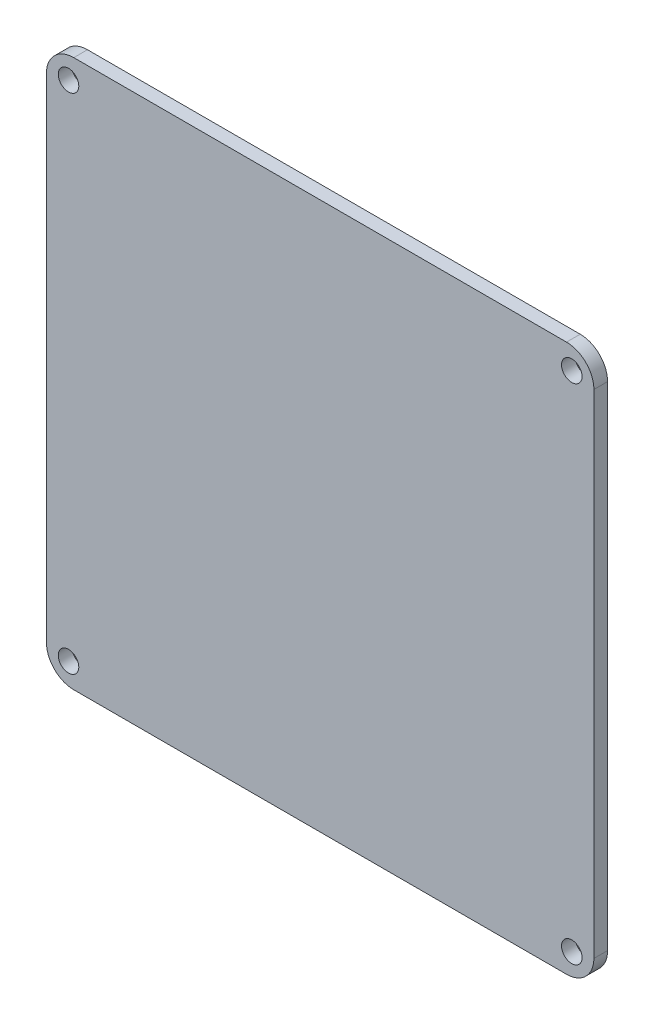
ISO-10303-21;
HEADER;
FILE_DESCRIPTION(('STEP AP214'),'2;1');
FILE_NAME('part.step','',(''),(''),'','','');
FILE_SCHEMA(('AUTOMOTIVE_DESIGN { 1 0 10303 214 1 1 1 1 }'));
ENDSEC;
DATA;
#1=APPLICATION_CONTEXT('core data for automotive mechanical design processes');
#2=APPLICATION_PROTOCOL_DEFINITION('international standard','automotive_design',2000,#1);
#3=PRODUCT_CONTEXT('',#1,'mechanical');
#4=PRODUCT('Part','Part','',(#3));
#5=PRODUCT_RELATED_PRODUCT_CATEGORY('part','',(#4));
#6=PRODUCT_DEFINITION_FORMATION('','',#4);
#7=PRODUCT_DEFINITION_CONTEXT('part definition',#1,'design');
#8=PRODUCT_DEFINITION('design','',#6,#7);
#9=PRODUCT_DEFINITION_SHAPE('','',#8);
#10=(LENGTH_UNIT() NAMED_UNIT(*) SI_UNIT(.MILLI.,.METRE.));
#11=(NAMED_UNIT(*) PLANE_ANGLE_UNIT() SI_UNIT($,.RADIAN.));
#12=(NAMED_UNIT(*) SI_UNIT($,.STERADIAN.) SOLID_ANGLE_UNIT());
#13=UNCERTAINTY_MEASURE_WITH_UNIT(LENGTH_MEASURE(1.E-05),#10,'distance_accuracy_value','');
#14=(GEOMETRIC_REPRESENTATION_CONTEXT(3) GLOBAL_UNCERTAINTY_ASSIGNED_CONTEXT((#13)) GLOBAL_UNIT_ASSIGNED_CONTEXT((#10,
#11,#12)) REPRESENTATION_CONTEXT('',''));
#15=CARTESIAN_POINT('',(0.,0.,0.));
#16=DIRECTION('',(0.,0.,1.));
#17=DIRECTION('',(1.,0.,0.));
#18=AXIS2_PLACEMENT_3D('',#15,#16,#17);
#19=CARTESIAN_POINT('',(-90.,-90.,5.));
#20=DIRECTION('',(0.,0.,1.));
#21=DIRECTION('',(1.,0.,0.));
#22=AXIS2_PLACEMENT_3D('',#19,#20,#21);
#23=PLANE('',#22);
#24=CARTESIAN_POINT('',(-91.9238815542511,91.9238815542512,5.));
#25=DIRECTION('',(0.,0.,1.));
#26=DIRECTION('',(1.,0.,0.));
#27=AXIS2_PLACEMENT_3D('',#24,#25,#26);
#28=CIRCLE('',#27,3.75000000000001);
#29=CARTESIAN_POINT('',(-88.1738815542511,91.9238815542512,5.));
#30=VERTEX_POINT('',#29);
#31=EDGE_CURVE('E193',#30,#30,#28,.T.);
#32=ORIENTED_EDGE('',*,*,#31,.F.);
#33=EDGE_LOOP('',(#32));
#34=FACE_BOUND('',#33,.T.);
#35=CARTESIAN_POINT('',(-91.9238815542512,-91.9238815542512,5.));
#36=DIRECTION('',(0.,0.,1.));
#37=DIRECTION('',(1.,0.,0.));
#38=AXIS2_PLACEMENT_3D('',#35,#36,#37);
#39=CIRCLE('',#38,3.75000000000001);
#40=CARTESIAN_POINT('',(-88.1738815542512,-91.9238815542512,5.));
#41=VERTEX_POINT('',#40);
#42=EDGE_CURVE('E186',#41,#41,#39,.T.);
#43=ORIENTED_EDGE('',*,*,#42,.F.);
#44=EDGE_LOOP('',(#43));
#45=FACE_BOUND('',#44,.T.);
#46=CARTESIAN_POINT('',(91.9238815542512,-91.9238815542511,5.));
#47=DIRECTION('',(0.,0.,1.));
#48=DIRECTION('',(1.,0.,0.));
#49=AXIS2_PLACEMENT_3D('',#46,#47,#48);
#50=CIRCLE('',#49,3.75000000000001);
#51=CARTESIAN_POINT('',(95.6738815542512,-91.9238815542511,5.));
#52=VERTEX_POINT('',#51);
#53=EDGE_CURVE('E187',#52,#52,#50,.T.);
#54=ORIENTED_EDGE('',*,*,#53,.F.);
#55=EDGE_LOOP('',(#54));
#56=FACE_BOUND('',#55,.T.);
#57=CARTESIAN_POINT('',(91.9238815542512,91.9238815542511,5.));
#58=DIRECTION('',(0.,0.,1.));
#59=DIRECTION('',(1.,0.,0.));
#60=AXIS2_PLACEMENT_3D('',#57,#58,#59);
#61=CIRCLE('',#60,3.75000000000001);
#62=CARTESIAN_POINT('',(95.6738815542512,91.9238815542511,5.));
#63=VERTEX_POINT('',#62);
#64=EDGE_CURVE('E179',#63,#63,#61,.T.);
#65=ORIENTED_EDGE('',*,*,#64,.F.);
#66=EDGE_LOOP('',(#65));
#67=FACE_BOUND('',#66,.T.);
#68=CARTESIAN_POINT('',(-90.,-90.,5.));
#69=DIRECTION('',(0.,0.,1.));
#70=DIRECTION('',(1.,0.,0.));
#71=AXIS2_PLACEMENT_3D('',#68,#69,#70);
#72=CIRCLE('',#71,9.99999999999999);
#73=CARTESIAN_POINT('',(-100.,-89.9999999999999,5.));
#74=VERTEX_POINT('',#73);
#75=CARTESIAN_POINT('',(-89.9999999999999,-100.,5.));
#76=VERTEX_POINT('',#75);
#77=EDGE_CURVE('E144',#74,#76,#72,.T.);
#78=ORIENTED_EDGE('',*,*,#77,.T.);
#79=DIRECTION('',(1.,0.,0.));
#80=VECTOR('',#79,1.);
#81=CARTESIAN_POINT('',(-89.9999999999999,-100.,5.));
#82=LINE('',#81,#80);
#83=CARTESIAN_POINT('',(90.,-100.,5.));
#84=VERTEX_POINT('',#83);
#85=EDGE_CURVE('E93',#76,#84,#82,.T.);
#86=ORIENTED_EDGE('',*,*,#85,.T.);
#87=CARTESIAN_POINT('',(90.0000000000001,-90.,5.));
#88=DIRECTION('',(0.,0.,1.));
#89=DIRECTION('',(-1.,0.,0.));
#90=AXIS2_PLACEMENT_3D('',#87,#88,#89);
#91=CIRCLE('',#90,9.99999999999999);
#92=CARTESIAN_POINT('',(100.,-89.9999999999999,5.));
#93=VERTEX_POINT('',#92);
#94=EDGE_CURVE('E159',#84,#93,#91,.T.);
#95=ORIENTED_EDGE('',*,*,#94,.T.);
#96=DIRECTION('',(0.,1.,0.));
#97=VECTOR('',#96,1.);
#98=CARTESIAN_POINT('',(100.,-89.9999999999999,5.));
#99=LINE('',#98,#97);
#100=CARTESIAN_POINT('',(100.,89.9999999999999,5.));
#101=VERTEX_POINT('',#100);
#102=EDGE_CURVE('E171',#93,#101,#99,.T.);
#103=ORIENTED_EDGE('',*,*,#102,.T.);
#104=CARTESIAN_POINT('',(90.0000000000001,90.,5.));
#105=DIRECTION('',(0.,0.,1.));
#106=DIRECTION('',(-1.,0.,0.));
#107=AXIS2_PLACEMENT_3D('',#104,#105,#106);
#108=CIRCLE('',#107,9.99999999999999);
#109=CARTESIAN_POINT('',(90.,100.,5.));
#110=VERTEX_POINT('',#109);
#111=EDGE_CURVE('E111',#101,#110,#108,.T.);
#112=ORIENTED_EDGE('',*,*,#111,.T.);
#113=DIRECTION('',(-1.,0.,0.));
#114=VECTOR('',#113,1.);
#115=CARTESIAN_POINT('',(-89.9999999999999,100.,5.));
#116=LINE('',#115,#114);
#117=CARTESIAN_POINT('',(-89.9999999999999,100.,5.));
#118=VERTEX_POINT('',#117);
#119=EDGE_CURVE('E106',#110,#118,#116,.T.);
#120=ORIENTED_EDGE('',*,*,#119,.T.);
#121=CARTESIAN_POINT('',(-90.,90.,5.));
#122=DIRECTION('',(0.,0.,1.));
#123=DIRECTION('',(1.,0.,0.));
#124=AXIS2_PLACEMENT_3D('',#121,#122,#123);
#125=CIRCLE('',#124,9.99999999999999);
#126=CARTESIAN_POINT('',(-100.,89.9999999999999,5.));
#127=VERTEX_POINT('',#126);
#128=EDGE_CURVE('E109',#118,#127,#125,.T.);
#129=ORIENTED_EDGE('',*,*,#128,.T.);
#130=DIRECTION('',(0.,-1.,0.));
#131=VECTOR('',#130,1.);
#132=CARTESIAN_POINT('',(-100.,-89.9999999999999,5.));
#133=LINE('',#132,#131);
#134=EDGE_CURVE('E50',#127,#74,#133,.T.);
#135=ORIENTED_EDGE('',*,*,#134,.T.);
#136=EDGE_LOOP('',(#78,#86,#95,#103,#112,#120,#129,#135));
#137=FACE_BOUND('',#136,.T.);
#138=ADVANCED_FACE('F33',(#34,#45,#56,#67,#137),#23,.T.);
#139=CARTESIAN_POINT('',(-90.,-90.,0.));
#140=DIRECTION('',(0.,0.,1.));
#141=DIRECTION('',(1.,0.,0.));
#142=AXIS2_PLACEMENT_3D('',#139,#140,#141);
#143=PLANE('',#142);
#144=CARTESIAN_POINT('',(-91.9238815542511,91.9238815542512,0.));
#145=DIRECTION('',(0.,0.,1.));
#146=DIRECTION('',(1.,0.,0.));
#147=AXIS2_PLACEMENT_3D('',#144,#145,#146);
#148=CIRCLE('',#147,3.75000000000001);
#149=CARTESIAN_POINT('',(-88.1738815542511,91.9238815542512,0.));
#150=VERTEX_POINT('',#149);
#151=EDGE_CURVE('E182',#150,#150,#148,.F.);
#152=ORIENTED_EDGE('',*,*,#151,.F.);
#153=EDGE_LOOP('',(#152));
#154=FACE_BOUND('',#153,.T.);
#155=CARTESIAN_POINT('',(-91.9238815542512,-91.9238815542512,0.));
#156=DIRECTION('',(0.,0.,1.));
#157=DIRECTION('',(1.,0.,0.));
#158=AXIS2_PLACEMENT_3D('',#155,#156,#157);
#159=CIRCLE('',#158,3.75000000000001);
#160=CARTESIAN_POINT('',(-88.1738815542512,-91.9238815542512,0.));
#161=VERTEX_POINT('',#160);
#162=EDGE_CURVE('E190',#161,#161,#159,.F.);
#163=ORIENTED_EDGE('',*,*,#162,.F.);
#164=EDGE_LOOP('',(#163));
#165=FACE_BOUND('',#164,.T.);
#166=CARTESIAN_POINT('',(91.9238815542512,-91.9238815542511,0.));
#167=DIRECTION('',(0.,0.,1.));
#168=DIRECTION('',(1.,0.,0.));
#169=AXIS2_PLACEMENT_3D('',#166,#167,#168);
#170=CIRCLE('',#169,3.75000000000001);
#171=CARTESIAN_POINT('',(95.6738815542512,-91.9238815542511,0.));
#172=VERTEX_POINT('',#171);
#173=EDGE_CURVE('E183',#172,#172,#170,.F.);
#174=ORIENTED_EDGE('',*,*,#173,.F.);
#175=EDGE_LOOP('',(#174));
#176=FACE_BOUND('',#175,.T.);
#177=CARTESIAN_POINT('',(91.9238815542512,91.9238815542511,0.));
#178=DIRECTION('',(0.,0.,1.));
#179=DIRECTION('',(1.,0.,0.));
#180=AXIS2_PLACEMENT_3D('',#177,#178,#179);
#181=CIRCLE('',#180,3.75000000000001);
#182=CARTESIAN_POINT('',(95.6738815542512,91.9238815542511,0.));
#183=VERTEX_POINT('',#182);
#184=EDGE_CURVE('E133',#183,#183,#181,.F.);
#185=ORIENTED_EDGE('',*,*,#184,.F.);
#186=EDGE_LOOP('',(#185));
#187=FACE_BOUND('',#186,.T.);
#188=CARTESIAN_POINT('',(-90.,-90.,0.));
#189=DIRECTION('',(0.,0.,1.));
#190=DIRECTION('',(1.,0.,0.));
#191=AXIS2_PLACEMENT_3D('',#188,#189,#190);
#192=CIRCLE('',#191,9.99999999999999);
#193=CARTESIAN_POINT('',(-100.,-89.9999999999999,0.));
#194=VERTEX_POINT('',#193);
#195=CARTESIAN_POINT('',(-89.9999999999999,-100.,0.));
#196=VERTEX_POINT('',#195);
#197=EDGE_CURVE('E129',#194,#196,#192,.T.);
#198=ORIENTED_EDGE('',*,*,#197,.F.);
#199=DIRECTION('',(0.,-1.,0.));
#200=VECTOR('',#199,1.);
#201=CARTESIAN_POINT('',(-100.,-89.9999999999999,0.));
#202=LINE('',#201,#200);
#203=CARTESIAN_POINT('',(-100.,89.9999999999999,0.));
#204=VERTEX_POINT('',#203);
#205=EDGE_CURVE('E85',#204,#194,#202,.T.);
#206=ORIENTED_EDGE('',*,*,#205,.F.);
#207=CARTESIAN_POINT('',(-90.,90.,0.));
#208=DIRECTION('',(0.,0.,1.));
#209=DIRECTION('',(1.,0.,0.));
#210=AXIS2_PLACEMENT_3D('',#207,#208,#209);
#211=CIRCLE('',#210,9.99999999999999);
#212=CARTESIAN_POINT('',(-89.9999999999999,100.,0.));
#213=VERTEX_POINT('',#212);
#214=EDGE_CURVE('E79',#213,#204,#211,.T.);
#215=ORIENTED_EDGE('',*,*,#214,.F.);
#216=DIRECTION('',(-1.,0.,0.));
#217=VECTOR('',#216,1.);
#218=CARTESIAN_POINT('',(-89.9999999999999,100.,0.));
#219=LINE('',#218,#217);
#220=CARTESIAN_POINT('',(90.,100.,0.));
#221=VERTEX_POINT('',#220);
#222=EDGE_CURVE('E119',#221,#213,#219,.T.);
#223=ORIENTED_EDGE('',*,*,#222,.F.);
#224=CARTESIAN_POINT('',(90.0000000000001,90.,0.));
#225=DIRECTION('',(0.,0.,1.));
#226=DIRECTION('',(-1.,0.,0.));
#227=AXIS2_PLACEMENT_3D('',#224,#225,#226);
#228=CIRCLE('',#227,9.99999999999999);
#229=CARTESIAN_POINT('',(100.,89.9999999999999,0.));
#230=VERTEX_POINT('',#229);
#231=EDGE_CURVE('E139',#230,#221,#228,.T.);
#232=ORIENTED_EDGE('',*,*,#231,.F.);
#233=DIRECTION('',(0.,1.,0.));
#234=VECTOR('',#233,1.);
#235=CARTESIAN_POINT('',(100.,-89.9999999999999,0.));
#236=LINE('',#235,#234);
#237=CARTESIAN_POINT('',(100.,-89.9999999999999,0.));
#238=VERTEX_POINT('',#237);
#239=EDGE_CURVE('E137',#238,#230,#236,.T.);
#240=ORIENTED_EDGE('',*,*,#239,.F.);
#241=CARTESIAN_POINT('',(90.0000000000001,-90.,0.));
#242=DIRECTION('',(0.,0.,1.));
#243=DIRECTION('',(-1.,0.,0.));
#244=AXIS2_PLACEMENT_3D('',#241,#242,#243);
#245=CIRCLE('',#244,9.99999999999999);
#246=CARTESIAN_POINT('',(90.,-100.,0.));
#247=VERTEX_POINT('',#246);
#248=EDGE_CURVE('E135',#247,#238,#245,.T.);
#249=ORIENTED_EDGE('',*,*,#248,.F.);
#250=DIRECTION('',(1.,0.,0.));
#251=VECTOR('',#250,1.);
#252=CARTESIAN_POINT('',(-89.9999999999999,-100.,0.));
#253=LINE('',#252,#251);
#254=EDGE_CURVE('E132',#196,#247,#253,.T.);
#255=ORIENTED_EDGE('',*,*,#254,.F.);
#256=EDGE_LOOP('',(#198,#206,#215,#223,#232,#240,#249,#255));
#257=FACE_BOUND('',#256,.T.);
#258=ADVANCED_FACE('F163',(#154,#165,#176,#187,#257),#143,.F.);
#259=CARTESIAN_POINT('',(-90.,-90.,5.));
#260=DIRECTION('',(0.,0.,-1.));
#261=DIRECTION('',(-1.,0.,0.));
#262=AXIS2_PLACEMENT_3D('',#259,#260,#261);
#263=CYLINDRICAL_SURFACE('',#262,9.99999999999999);
#264=ORIENTED_EDGE('',*,*,#197,.T.);
#265=DIRECTION('',(0.,0.,-1.));
#266=VECTOR('',#265,1.);
#267=CARTESIAN_POINT('',(-89.9999999999999,-100.,5.));
#268=LINE('',#267,#266);
#269=EDGE_CURVE('E11',#76,#196,#268,.T.);
#270=ORIENTED_EDGE('',*,*,#269,.F.);
#271=ORIENTED_EDGE('',*,*,#77,.F.);
#272=DIRECTION('',(0.,0.,-1.));
#273=VECTOR('',#272,1.);
#274=CARTESIAN_POINT('',(-100.,-89.9999999999999,5.));
#275=LINE('',#274,#273);
#276=EDGE_CURVE('E125',#74,#194,#275,.T.);
#277=ORIENTED_EDGE('',*,*,#276,.T.);
#278=EDGE_LOOP('',(#264,#270,#271,#277));
#279=FACE_BOUND('',#278,.T.);
#280=ADVANCED_FACE('F35',(#279),#263,.T.);
#281=CARTESIAN_POINT('',(-89.9999999999999,-100.,5.));
#282=DIRECTION('',(0.,1.,0.));
#283=DIRECTION('',(0.,0.,1.));
#284=AXIS2_PLACEMENT_3D('',#281,#282,#283);
#285=PLANE('',#284);
#286=ORIENTED_EDGE('',*,*,#254,.T.);
#287=DIRECTION('',(0.,0.,-1.));
#288=VECTOR('',#287,1.);
#289=CARTESIAN_POINT('',(90.,-100.,5.));
#290=LINE('',#289,#288);
#291=EDGE_CURVE('E42',#84,#247,#290,.T.);
#292=ORIENTED_EDGE('',*,*,#291,.F.);
#293=ORIENTED_EDGE('',*,*,#85,.F.);
#294=ORIENTED_EDGE('',*,*,#269,.T.);
#295=EDGE_LOOP('',(#286,#292,#293,#294));
#296=FACE_BOUND('',#295,.T.);
#297=ADVANCED_FACE('F227',(#296),#285,.F.);
#298=CARTESIAN_POINT('',(90.0000000000001,-90.,5.));
#299=DIRECTION('',(0.,0.,-1.));
#300=DIRECTION('',(-1.,0.,0.));
#301=AXIS2_PLACEMENT_3D('',#298,#299,#300);
#302=CYLINDRICAL_SURFACE('',#301,9.99999999999999);
#303=ORIENTED_EDGE('',*,*,#248,.T.);
#304=DIRECTION('',(0.,0.,-1.));
#305=VECTOR('',#304,1.);
#306=CARTESIAN_POINT('',(100.,-89.9999999999999,5.));
#307=LINE('',#306,#305);
#308=EDGE_CURVE('E151',#93,#238,#307,.T.);
#309=ORIENTED_EDGE('',*,*,#308,.F.);
#310=ORIENTED_EDGE('',*,*,#94,.F.);
#311=ORIENTED_EDGE('',*,*,#291,.T.);
#312=EDGE_LOOP('',(#303,#309,#310,#311));
#313=FACE_BOUND('',#312,.T.);
#314=ADVANCED_FACE('F157',(#313),#302,.T.);
#315=CARTESIAN_POINT('',(100.,-89.9999999999999,5.));
#316=DIRECTION('',(-1.,0.,0.));
#317=DIRECTION('',(0.,0.,1.));
#318=AXIS2_PLACEMENT_3D('',#315,#316,#317);
#319=PLANE('',#318);
#320=ORIENTED_EDGE('',*,*,#239,.T.);
#321=DIRECTION('',(0.,0.,-1.));
#322=VECTOR('',#321,1.);
#323=CARTESIAN_POINT('',(100.,89.9999999999999,5.));
#324=LINE('',#323,#322);
#325=EDGE_CURVE('E148',#101,#230,#324,.T.);
#326=ORIENTED_EDGE('',*,*,#325,.F.);
#327=ORIENTED_EDGE('',*,*,#102,.F.);
#328=ORIENTED_EDGE('',*,*,#308,.T.);
#329=EDGE_LOOP('',(#320,#326,#327,#328));
#330=FACE_BOUND('',#329,.T.);
#331=ADVANCED_FACE('F167',(#330),#319,.F.);
#332=CARTESIAN_POINT('',(90.0000000000001,90.,5.));
#333=DIRECTION('',(0.,0.,-1.));
#334=DIRECTION('',(-1.,0.,0.));
#335=AXIS2_PLACEMENT_3D('',#332,#333,#334);
#336=CYLINDRICAL_SURFACE('',#335,9.99999999999999);
#337=ORIENTED_EDGE('',*,*,#231,.T.);
#338=DIRECTION('',(0.,0.,-1.));
#339=VECTOR('',#338,1.);
#340=CARTESIAN_POINT('',(90.,100.,5.));
#341=LINE('',#340,#339);
#342=EDGE_CURVE('E120',#110,#221,#341,.T.);
#343=ORIENTED_EDGE('',*,*,#342,.F.);
#344=ORIENTED_EDGE('',*,*,#111,.F.);
#345=ORIENTED_EDGE('',*,*,#325,.T.);
#346=EDGE_LOOP('',(#337,#343,#344,#345));
#347=FACE_BOUND('',#346,.T.);
#348=ADVANCED_FACE('F170',(#347),#336,.T.);
#349=CARTESIAN_POINT('',(-89.9999999999999,100.,5.));
#350=DIRECTION('',(0.,-1.,0.));
#351=DIRECTION('',(0.,0.,-1.));
#352=AXIS2_PLACEMENT_3D('',#349,#350,#351);
#353=PLANE('',#352);
#354=ORIENTED_EDGE('',*,*,#222,.T.);
#355=DIRECTION('',(0.,0.,-1.));
#356=VECTOR('',#355,1.);
#357=CARTESIAN_POINT('',(-89.9999999999999,100.,5.));
#358=LINE('',#357,#356);
#359=EDGE_CURVE('E116',#118,#213,#358,.T.);
#360=ORIENTED_EDGE('',*,*,#359,.F.);
#361=ORIENTED_EDGE('',*,*,#119,.F.);
#362=ORIENTED_EDGE('',*,*,#342,.T.);
#363=EDGE_LOOP('',(#354,#360,#361,#362));
#364=FACE_BOUND('',#363,.T.);
#365=ADVANCED_FACE('F117',(#364),#353,.F.);
#366=CARTESIAN_POINT('',(-90.,90.,5.));
#367=DIRECTION('',(0.,0.,-1.));
#368=DIRECTION('',(-1.,0.,0.));
#369=AXIS2_PLACEMENT_3D('',#366,#367,#368);
#370=CYLINDRICAL_SURFACE('',#369,9.99999999999999);
#371=ORIENTED_EDGE('',*,*,#214,.T.);
#372=DIRECTION('',(0.,0.,-1.));
#373=VECTOR('',#372,1.);
#374=CARTESIAN_POINT('',(-100.,89.9999999999999,5.));
#375=LINE('',#374,#373);
#376=EDGE_CURVE('E121',#127,#204,#375,.T.);
#377=ORIENTED_EDGE('',*,*,#376,.F.);
#378=ORIENTED_EDGE('',*,*,#128,.F.);
#379=ORIENTED_EDGE('',*,*,#359,.T.);
#380=EDGE_LOOP('',(#371,#377,#378,#379));
#381=FACE_BOUND('',#380,.T.);
#382=ADVANCED_FACE('F123',(#381),#370,.T.);
#383=CARTESIAN_POINT('',(-100.,-89.9999999999999,5.));
#384=DIRECTION('',(1.,0.,0.));
#385=DIRECTION('',(0.,0.,-1.));
#386=AXIS2_PLACEMENT_3D('',#383,#384,#385);
#387=PLANE('',#386);
#388=ORIENTED_EDGE('',*,*,#205,.T.);
#389=ORIENTED_EDGE('',*,*,#276,.F.);
#390=ORIENTED_EDGE('',*,*,#134,.F.);
#391=ORIENTED_EDGE('',*,*,#376,.T.);
#392=EDGE_LOOP('',(#388,#389,#390,#391));
#393=FACE_BOUND('',#392,.T.);
#394=ADVANCED_FACE('F217',(#393),#387,.F.);
#395=CARTESIAN_POINT('',(91.9238815542512,91.9238815542511,-0.00100000000000013));
#396=DIRECTION('',(0.,0.,1.));
#397=DIRECTION('',(1.,0.,0.));
#398=AXIS2_PLACEMENT_3D('',#395,#396,#397);
#399=CYLINDRICAL_SURFACE('',#398,3.75000000000001);
#400=ORIENTED_EDGE('',*,*,#64,.T.);
#401=EDGE_LOOP('',(#400));
#402=FACE_BOUND('',#401,.T.);
#403=ORIENTED_EDGE('',*,*,#184,.T.);
#404=EDGE_LOOP('',(#403));
#405=FACE_BOUND('',#404,.T.);
#406=ADVANCED_FACE('F213',(#402,#405),#399,.F.);
#407=CARTESIAN_POINT('',(91.9238815542512,-91.9238815542511,-0.00100000000000013));
#408=DIRECTION('',(0.,0.,1.));
#409=DIRECTION('',(1.,0.,0.));
#410=AXIS2_PLACEMENT_3D('',#407,#408,#409);
#411=CYLINDRICAL_SURFACE('',#410,3.75000000000001);
#412=ORIENTED_EDGE('',*,*,#53,.T.);
#413=EDGE_LOOP('',(#412));
#414=FACE_BOUND('',#413,.T.);
#415=ORIENTED_EDGE('',*,*,#173,.T.);
#416=EDGE_LOOP('',(#415));
#417=FACE_BOUND('',#416,.T.);
#418=ADVANCED_FACE('F216',(#414,#417),#411,.F.);
#419=CARTESIAN_POINT('',(-91.9238815542512,-91.9238815542512,-0.00100000000000013));
#420=DIRECTION('',(0.,0.,1.));
#421=DIRECTION('',(1.,0.,0.));
#422=AXIS2_PLACEMENT_3D('',#419,#420,#421);
#423=CYLINDRICAL_SURFACE('',#422,3.75000000000001);
#424=ORIENTED_EDGE('',*,*,#42,.T.);
#425=EDGE_LOOP('',(#424));
#426=FACE_BOUND('',#425,.T.);
#427=ORIENTED_EDGE('',*,*,#162,.T.);
#428=EDGE_LOOP('',(#427));
#429=FACE_BOUND('',#428,.T.);
#430=ADVANCED_FACE('F285',(#426,#429),#423,.F.);
#431=CARTESIAN_POINT('',(-91.9238815542511,91.9238815542512,-0.00100000000000013));
#432=DIRECTION('',(0.,0.,1.));
#433=DIRECTION('',(1.,0.,0.));
#434=AXIS2_PLACEMENT_3D('',#431,#432,#433);
#435=CYLINDRICAL_SURFACE('',#434,3.75000000000001);
#436=ORIENTED_EDGE('',*,*,#31,.T.);
#437=EDGE_LOOP('',(#436));
#438=FACE_BOUND('',#437,.T.);
#439=ORIENTED_EDGE('',*,*,#151,.T.);
#440=EDGE_LOOP('',(#439));
#441=FACE_BOUND('',#440,.T.);
#442=ADVANCED_FACE('F201',(#438,#441),#435,.F.);
#443=CLOSED_SHELL('',(#138,#258,#280,#297,#314,#331,#348,#365,#382,#394,#406,#418,#430,#442));
#444=MANIFOLD_SOLID_BREP('B2',#443);
#445=ADVANCED_BREP_SHAPE_REPRESENTATION('',(#18,#444),#14);
#446=SHAPE_DEFINITION_REPRESENTATION(#9,#445);
ENDSEC;
END-ISO-10303-21;
